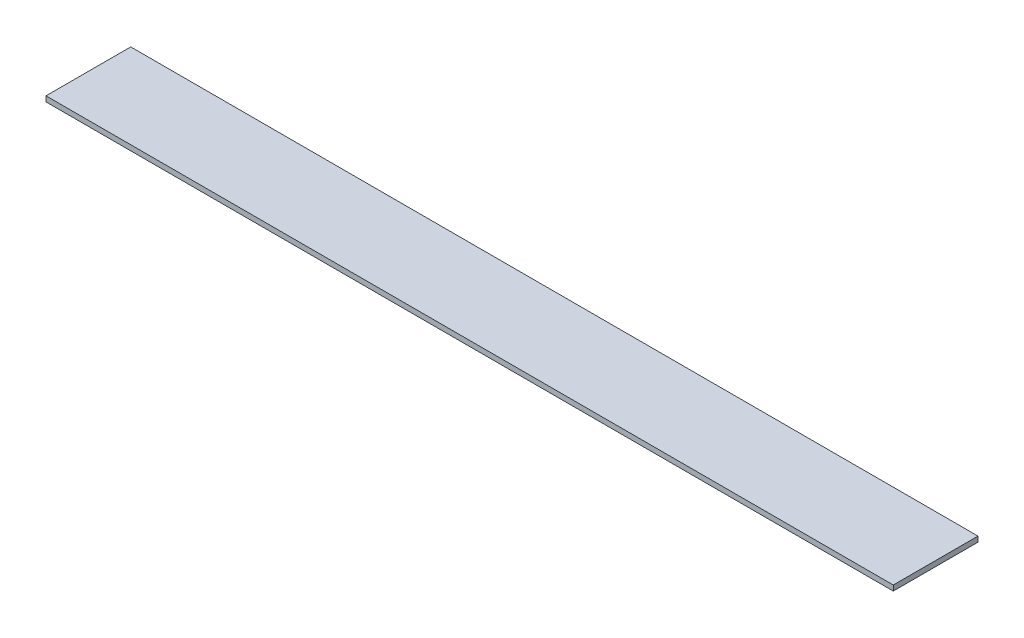
ISO-10303-21;
HEADER;
FILE_DESCRIPTION(('STEP AP214'),'2;1');
FILE_NAME('part.step','',(''),(''),'','','');
FILE_SCHEMA(('AUTOMOTIVE_DESIGN { 1 0 10303 214 1 1 1 1 }'));
ENDSEC;
DATA;
#1=APPLICATION_CONTEXT('core data for automotive mechanical design processes');
#2=APPLICATION_PROTOCOL_DEFINITION('international standard','automotive_design',2000,#1);
#3=PRODUCT_CONTEXT('',#1,'mechanical');
#4=PRODUCT('Part','Part','',(#3));
#5=PRODUCT_RELATED_PRODUCT_CATEGORY('part','',(#4));
#6=PRODUCT_DEFINITION_FORMATION('','',#4);
#7=PRODUCT_DEFINITION_CONTEXT('part definition',#1,'design');
#8=PRODUCT_DEFINITION('design','',#6,#7);
#9=PRODUCT_DEFINITION_SHAPE('','',#8);
#10=(LENGTH_UNIT() NAMED_UNIT(*) SI_UNIT(.MILLI.,.METRE.));
#11=(NAMED_UNIT(*) PLANE_ANGLE_UNIT() SI_UNIT($,.RADIAN.));
#12=(NAMED_UNIT(*) SI_UNIT($,.STERADIAN.) SOLID_ANGLE_UNIT());
#13=UNCERTAINTY_MEASURE_WITH_UNIT(LENGTH_MEASURE(1.E-05),#10,'distance_accuracy_value','');
#14=(GEOMETRIC_REPRESENTATION_CONTEXT(3) GLOBAL_UNCERTAINTY_ASSIGNED_CONTEXT((#13)) GLOBAL_UNIT_ASSIGNED_CONTEXT((#10,
#11,#12)) REPRESENTATION_CONTEXT('',''));
#15=CARTESIAN_POINT('',(0.,0.,0.));
#16=DIRECTION('',(0.,0.,1.));
#17=DIRECTION('',(1.,0.,0.));
#18=AXIS2_PLACEMENT_3D('',#15,#16,#17);
#19=CARTESIAN_POINT('',(127.,1.5875,12.7));
#20=DIRECTION('',(-1.,0.,0.));
#21=DIRECTION('',(0.,0.,1.));
#22=AXIS2_PLACEMENT_3D('',#19,#20,#21);
#23=PLANE('',#22);
#24=DIRECTION('',(0.,0.,-1.));
#25=VECTOR('',#24,1.);
#26=CARTESIAN_POINT('',(127.,0.,12.7));
#27=LINE('',#26,#25);
#28=CARTESIAN_POINT('',(127.,0.,12.7));
#29=VERTEX_POINT('',#28);
#30=CARTESIAN_POINT('',(127.,0.,-12.7));
#31=VERTEX_POINT('',#30);
#32=EDGE_CURVE('E98',#29,#31,#27,.T.);
#33=ORIENTED_EDGE('',*,*,#32,.T.);
#34=DIRECTION('',(0.,-1.,0.));
#35=VECTOR('',#34,1.);
#36=CARTESIAN_POINT('',(127.,1.5875,-12.7));
#37=LINE('',#36,#35);
#38=CARTESIAN_POINT('',(127.,1.5875,-12.7));
#39=VERTEX_POINT('',#38);
#40=EDGE_CURVE('E11',#39,#31,#37,.T.);
#41=ORIENTED_EDGE('',*,*,#40,.F.);
#42=DIRECTION('',(0.,0.,-1.));
#43=VECTOR('',#42,1.);
#44=CARTESIAN_POINT('',(127.,1.5875,12.7));
#45=LINE('',#44,#43);
#46=CARTESIAN_POINT('',(127.,1.5875,12.7));
#47=VERTEX_POINT('',#46);
#48=EDGE_CURVE('E86',#47,#39,#45,.T.);
#49=ORIENTED_EDGE('',*,*,#48,.F.);
#50=DIRECTION('',(0.,-1.,0.));
#51=VECTOR('',#50,1.);
#52=CARTESIAN_POINT('',(127.,1.5875,12.7));
#53=LINE('',#52,#51);
#54=EDGE_CURVE('E94',#47,#29,#53,.T.);
#55=ORIENTED_EDGE('',*,*,#54,.T.);
#56=EDGE_LOOP('',(#33,#41,#49,#55));
#57=FACE_BOUND('',#56,.T.);
#58=ADVANCED_FACE('F35',(#57),#23,.F.);
#59=CARTESIAN_POINT('',(-127.,1.5875,-12.7));
#60=DIRECTION('',(0.,0.,1.));
#61=DIRECTION('',(1.,0.,0.));
#62=AXIS2_PLACEMENT_3D('',#59,#60,#61);
#63=PLANE('',#62);
#64=DIRECTION('',(-1.,0.,0.));
#65=VECTOR('',#64,1.);
#66=CARTESIAN_POINT('',(-127.,0.,-12.7));
#67=LINE('',#66,#65);
#68=CARTESIAN_POINT('',(-127.,0.,-12.7));
#69=VERTEX_POINT('',#68);
#70=EDGE_CURVE('E90',#31,#69,#67,.T.);
#71=ORIENTED_EDGE('',*,*,#70,.T.);
#72=DIRECTION('',(0.,-1.,0.));
#73=VECTOR('',#72,1.);
#74=CARTESIAN_POINT('',(-127.,1.5875,-12.7));
#75=LINE('',#74,#73);
#76=CARTESIAN_POINT('',(-127.,1.5875,-12.7));
#77=VERTEX_POINT('',#76);
#78=EDGE_CURVE('E43',#77,#69,#75,.T.);
#79=ORIENTED_EDGE('',*,*,#78,.F.);
#80=DIRECTION('',(-1.,0.,0.));
#81=VECTOR('',#80,1.);
#82=CARTESIAN_POINT('',(-127.,1.5875,-12.7));
#83=LINE('',#82,#81);
#84=EDGE_CURVE('E81',#39,#77,#83,.T.);
#85=ORIENTED_EDGE('',*,*,#84,.F.);
#86=ORIENTED_EDGE('',*,*,#40,.T.);
#87=EDGE_LOOP('',(#71,#79,#85,#86));
#88=FACE_BOUND('',#87,.T.);
#89=ADVANCED_FACE('F89',(#88),#63,.F.);
#90=CARTESIAN_POINT('',(-127.,1.5875,12.7));
#91=DIRECTION('',(1.,0.,0.));
#92=DIRECTION('',(0.,0.,-1.));
#93=AXIS2_PLACEMENT_3D('',#90,#91,#92);
#94=PLANE('',#93);
#95=DIRECTION('',(0.,0.,1.));
#96=VECTOR('',#95,1.);
#97=CARTESIAN_POINT('',(-127.,0.,12.7));
#98=LINE('',#97,#96);
#99=CARTESIAN_POINT('',(-127.,0.,12.7));
#100=VERTEX_POINT('',#99);
#101=EDGE_CURVE('E68',#69,#100,#98,.T.);
#102=ORIENTED_EDGE('',*,*,#101,.T.);
#103=DIRECTION('',(0.,-1.,0.));
#104=VECTOR('',#103,1.);
#105=CARTESIAN_POINT('',(-127.,1.5875,12.7));
#106=LINE('',#105,#104);
#107=CARTESIAN_POINT('',(-127.,1.5875,12.7));
#108=VERTEX_POINT('',#107);
#109=EDGE_CURVE('E91',#108,#100,#106,.T.);
#110=ORIENTED_EDGE('',*,*,#109,.F.);
#111=DIRECTION('',(0.,0.,1.));
#112=VECTOR('',#111,1.);
#113=CARTESIAN_POINT('',(-127.,1.5875,12.7));
#114=LINE('',#113,#112);
#115=EDGE_CURVE('E84',#77,#108,#114,.T.);
#116=ORIENTED_EDGE('',*,*,#115,.F.);
#117=ORIENTED_EDGE('',*,*,#78,.T.);
#118=EDGE_LOOP('',(#102,#110,#116,#117));
#119=FACE_BOUND('',#118,.T.);
#120=ADVANCED_FACE('F92',(#119),#94,.F.);
#121=CARTESIAN_POINT('',(-127.,1.5875,12.7));
#122=DIRECTION('',(0.,0.,-1.));
#123=DIRECTION('',(-1.,0.,0.));
#124=AXIS2_PLACEMENT_3D('',#121,#122,#123);
#125=PLANE('',#124);
#126=DIRECTION('',(1.,0.,0.));
#127=VECTOR('',#126,1.);
#128=CARTESIAN_POINT('',(-127.,0.,12.7));
#129=LINE('',#128,#127);
#130=EDGE_CURVE('E74',#100,#29,#129,.T.);
#131=ORIENTED_EDGE('',*,*,#130,.T.);
#132=ORIENTED_EDGE('',*,*,#54,.F.);
#133=DIRECTION('',(1.,0.,0.));
#134=VECTOR('',#133,1.);
#135=CARTESIAN_POINT('',(-127.,1.5875,12.7));
#136=LINE('',#135,#134);
#137=EDGE_CURVE('E51',#108,#47,#136,.T.);
#138=ORIENTED_EDGE('',*,*,#137,.F.);
#139=ORIENTED_EDGE('',*,*,#109,.T.);
#140=EDGE_LOOP('',(#131,#132,#138,#139));
#141=FACE_BOUND('',#140,.T.);
#142=ADVANCED_FACE('F105',(#141),#125,.F.);
#143=CARTESIAN_POINT('',(0.,1.5875,0.));
#144=DIRECTION('',(0.,-1.,0.));
#145=DIRECTION('',(0.,0.,-1.));
#146=AXIS2_PLACEMENT_3D('',#143,#144,#145);
#147=PLANE('',#146);
#148=ORIENTED_EDGE('',*,*,#48,.T.);
#149=ORIENTED_EDGE('',*,*,#84,.T.);
#150=ORIENTED_EDGE('',*,*,#115,.T.);
#151=ORIENTED_EDGE('',*,*,#137,.T.);
#152=EDGE_LOOP('',(#148,#149,#150,#151));
#153=FACE_BOUND('',#152,.T.);
#154=ADVANCED_FACE('F82',(#153),#147,.F.);
#155=CARTESIAN_POINT('',(0.,0.,0.));
#156=DIRECTION('',(0.,-1.,0.));
#157=DIRECTION('',(0.,0.,-1.));
#158=AXIS2_PLACEMENT_3D('',#155,#156,#157);
#159=PLANE('',#158);
#160=ORIENTED_EDGE('',*,*,#32,.F.);
#161=ORIENTED_EDGE('',*,*,#130,.F.);
#162=ORIENTED_EDGE('',*,*,#101,.F.);
#163=ORIENTED_EDGE('',*,*,#70,.F.);
#164=EDGE_LOOP('',(#160,#161,#162,#163));
#165=FACE_BOUND('',#164,.T.);
#166=ADVANCED_FACE('F108',(#165),#159,.T.);
#167=CLOSED_SHELL('',(#58,#89,#120,#142,#154,#166));
#168=MANIFOLD_SOLID_BREP('B2',#167);
#169=ADVANCED_BREP_SHAPE_REPRESENTATION('',(#18,#168),#14);
#170=SHAPE_DEFINITION_REPRESENTATION(#9,#169);
ENDSEC;
END-ISO-10303-21;
